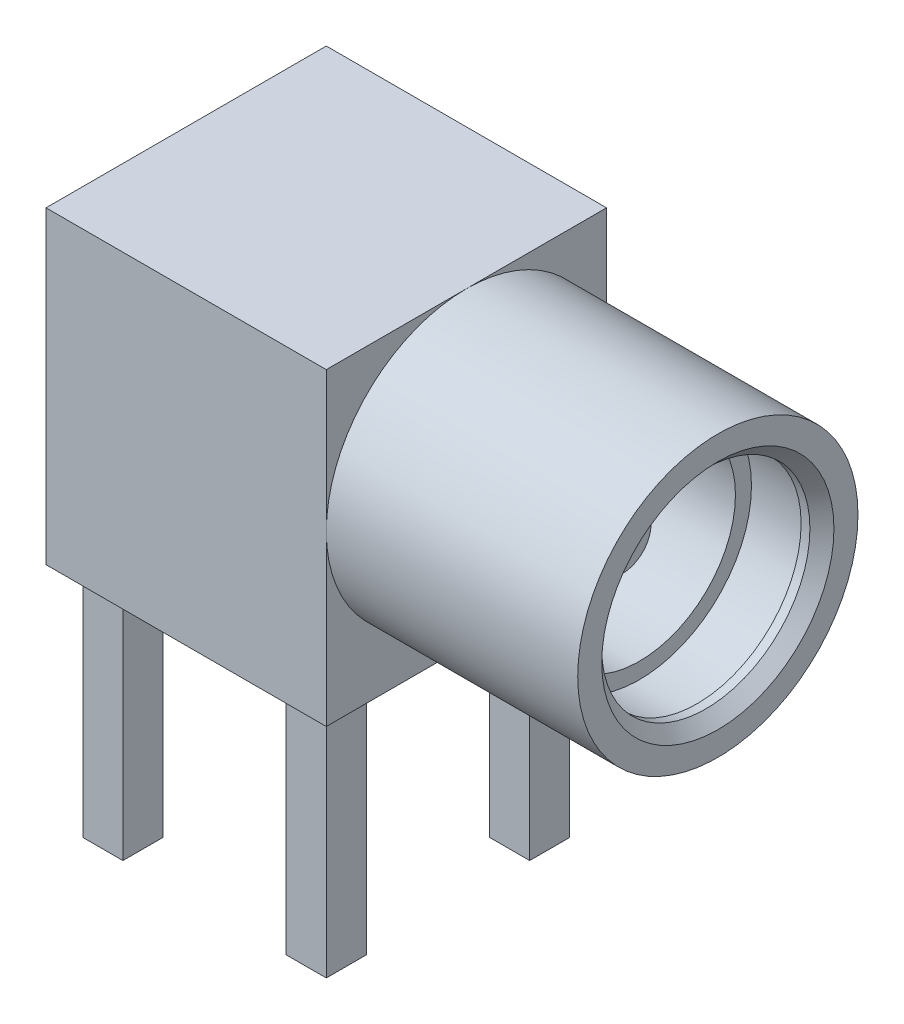
ISO-10303-21;
HEADER;
FILE_DESCRIPTION(('STEP AP214'),'2;1');
FILE_NAME('part.step','',(''),(''),'','','');
FILE_SCHEMA(('AUTOMOTIVE_DESIGN { 1 0 10303 214 1 1 1 1 }'));
ENDSEC;
DATA;
#1=APPLICATION_CONTEXT('core data for automotive mechanical design processes');
#2=APPLICATION_PROTOCOL_DEFINITION('international standard','automotive_design',2000,#1);
#3=PRODUCT_CONTEXT('',#1,'mechanical');
#4=PRODUCT('Part','Part','',(#3));
#5=PRODUCT_RELATED_PRODUCT_CATEGORY('part','',(#4));
#6=PRODUCT_DEFINITION_FORMATION('','',#4);
#7=PRODUCT_DEFINITION_CONTEXT('part definition',#1,'design');
#8=PRODUCT_DEFINITION('design','',#6,#7);
#9=PRODUCT_DEFINITION_SHAPE('','',#8);
#10=(LENGTH_UNIT() NAMED_UNIT(*) SI_UNIT(.MILLI.,.METRE.));
#11=(NAMED_UNIT(*) PLANE_ANGLE_UNIT() SI_UNIT($,.RADIAN.));
#12=(NAMED_UNIT(*) SI_UNIT($,.STERADIAN.) SOLID_ANGLE_UNIT());
#13=UNCERTAINTY_MEASURE_WITH_UNIT(LENGTH_MEASURE(1.E-05),#10,'distance_accuracy_value','');
#14=(GEOMETRIC_REPRESENTATION_CONTEXT(3) GLOBAL_UNCERTAINTY_ASSIGNED_CONTEXT((#13)) GLOBAL_UNIT_ASSIGNED_CONTEXT((#10,
#11,#12)) REPRESENTATION_CONTEXT('',''));
#15=CARTESIAN_POINT('',(0.,0.,0.));
#16=DIRECTION('',(0.,0.,1.));
#17=DIRECTION('',(1.,0.,0.));
#18=AXIS2_PLACEMENT_3D('',#15,#16,#17);
#19=CARTESIAN_POINT('',(43.4625000000001,-43.6500000000006,22.54));
#20=DIRECTION('',(1.,0.,0.));
#21=DIRECTION('',(0.,0.,-1.));
#22=AXIS2_PLACEMENT_3D('',#19,#20,#21);
#23=PLANE('',#22);
#24=CARTESIAN_POINT('',(43.4625000000001,-43.6500000000006,22.54));
#25=DIRECTION('',(1.,0.,0.));
#26=DIRECTION('',(0.,0.,-1.));
#27=AXIS2_PLACEMENT_3D('',#24,#25,#26);
#28=CIRCLE('',#27,0.355);
#29=CARTESIAN_POINT('',(43.4625000000001,-43.6500000000006,22.185));
#30=VERTEX_POINT('',#29);
#31=EDGE_CURVE('E20',#30,#30,#28,.F.);
#32=ORIENTED_EDGE('',*,*,#31,.F.);
#33=EDGE_LOOP('',(#32));
#34=FACE_BOUND('',#33,.T.);
#35=ADVANCED_FACE('F17',(#34),#23,.T.);
#36=CARTESIAN_POINT('',(42.0625000000001,-43.6500000000006,22.54));
#37=DIRECTION('',(1.,0.,0.));
#38=DIRECTION('',(0.,0.,-1.));
#39=AXIS2_PLACEMENT_3D('',#36,#37,#38);
#40=CYLINDRICAL_SURFACE('',#39,0.355);
#41=CARTESIAN_POINT('',(42.0625000000001,-43.6500000000006,22.54));
#42=DIRECTION('',(1.,0.,0.));
#43=DIRECTION('',(0.,0.,-1.));
#44=AXIS2_PLACEMENT_3D('',#41,#42,#43);
#45=CIRCLE('',#44,0.355);
#46=CARTESIAN_POINT('',(42.0625000000001,-43.6500000000006,22.185));
#47=VERTEX_POINT('',#46);
#48=EDGE_CURVE('E375',#47,#47,#45,.F.);
#49=ORIENTED_EDGE('',*,*,#48,.F.);
#50=EDGE_LOOP('',(#49));
#51=FACE_BOUND('',#50,.T.);
#52=ORIENTED_EDGE('',*,*,#31,.T.);
#53=EDGE_LOOP('',(#52));
#54=FACE_BOUND('',#53,.T.);
#55=ADVANCED_FACE('F382',(#51,#54),#40,.T.);
#56=CARTESIAN_POINT('',(42.0625000000001,-43.6500000000006,22.54));
#57=DIRECTION('',(1.,0.,0.));
#58=DIRECTION('',(0.,0.,-1.));
#59=AXIS2_PLACEMENT_3D('',#56,#57,#58);
#60=PLANE('',#59);
#61=ORIENTED_EDGE('',*,*,#48,.T.);
#62=EDGE_LOOP('',(#61));
#63=FACE_BOUND('',#62,.T.);
#64=CARTESIAN_POINT('',(42.0625000000001,-43.6500000000006,22.54));
#65=DIRECTION('',(1.,0.,0.));
#66=DIRECTION('',(0.,0.,-1.));
#67=AXIS2_PLACEMENT_3D('',#64,#65,#66);
#68=CIRCLE('',#67,1.2);
#69=CARTESIAN_POINT('',(42.0625000000001,-43.6500000000006,21.34));
#70=VERTEX_POINT('',#69);
#71=EDGE_CURVE('E373',#70,#70,#68,.T.);
#72=ORIENTED_EDGE('',*,*,#71,.T.);
#73=EDGE_LOOP('',(#72));
#74=FACE_BOUND('',#73,.T.);
#75=ADVANCED_FACE('F389',(#63,#74),#60,.T.);
#76=CARTESIAN_POINT('',(44.6525000000001,-43.6500000000006,22.54));
#77=DIRECTION('',(1.,0.,0.));
#78=DIRECTION('',(0.,0.,-1.));
#79=AXIS2_PLACEMENT_3D('',#76,#77,#78);
#80=CYLINDRICAL_SURFACE('',#79,1.2);
#81=CARTESIAN_POINT('',(43.6725000000001,-43.6500000000006,22.54));
#82=DIRECTION('',(1.,0.,0.));
#83=DIRECTION('',(0.,0.,-1.));
#84=AXIS2_PLACEMENT_3D('',#81,#82,#83);
#85=CIRCLE('',#84,1.2);
#86=CARTESIAN_POINT('',(43.6725000000001,-43.6500000000006,21.34));
#87=VERTEX_POINT('',#86);
#88=EDGE_CURVE('E370',#87,#87,#85,.F.);
#89=ORIENTED_EDGE('',*,*,#88,.F.);
#90=EDGE_LOOP('',(#89));
#91=FACE_BOUND('',#90,.T.);
#92=ORIENTED_EDGE('',*,*,#71,.F.);
#93=EDGE_LOOP('',(#92));
#94=FACE_BOUND('',#93,.T.);
#95=ADVANCED_FACE('F540',(#91,#94),#80,.F.);
#96=CARTESIAN_POINT('',(43.6725000000001,-43.6500000000006,23.3175));
#97=DIRECTION('',(1.,0.,0.));
#98=DIRECTION('',(0.,0.,-1.));
#99=AXIS2_PLACEMENT_3D('',#96,#97,#98);
#100=PLANE('',#99);
#101=ORIENTED_EDGE('',*,*,#88,.T.);
#102=EDGE_LOOP('',(#101));
#103=FACE_BOUND('',#102,.T.);
#104=CARTESIAN_POINT('',(43.6725000000001,-43.6500000000006,22.54));
#105=DIRECTION('',(1.,0.,0.));
#106=DIRECTION('',(0.,0.,-1.));
#107=AXIS2_PLACEMENT_3D('',#104,#105,#106);
#108=CIRCLE('',#107,1.4);
#109=CARTESIAN_POINT('',(43.6725000000001,-43.6500000000006,21.14));
#110=VERTEX_POINT('',#109);
#111=EDGE_CURVE('E344',#110,#110,#108,.T.);
#112=ORIENTED_EDGE('',*,*,#111,.T.);
#113=EDGE_LOOP('',(#112));
#114=FACE_BOUND('',#113,.T.);
#115=ADVANCED_FACE('F536',(#103,#114),#100,.T.);
#116=CARTESIAN_POINT('',(43.6725000000001,-43.6500000000006,22.54));
#117=DIRECTION('',(1.,0.,0.));
#118=DIRECTION('',(0.,0.,-1.));
#119=AXIS2_PLACEMENT_3D('',#116,#117,#118);
#120=CYLINDRICAL_SURFACE('',#119,1.4);
#121=CARTESIAN_POINT('',(44.3925000000001,-43.6500000000006,22.54));
#122=DIRECTION('',(1.,0.,0.));
#123=DIRECTION('',(0.,0.,-1.));
#124=AXIS2_PLACEMENT_3D('',#121,#122,#123);
#125=CIRCLE('',#124,1.4);
#126=CARTESIAN_POINT('',(44.3925000000001,-43.6500000000006,21.14));
#127=VERTEX_POINT('',#126);
#128=EDGE_CURVE('E335',#127,#127,#125,.T.);
#129=ORIENTED_EDGE('',*,*,#128,.T.);
#130=EDGE_LOOP('',(#129));
#131=FACE_BOUND('',#130,.T.);
#132=ORIENTED_EDGE('',*,*,#111,.F.);
#133=EDGE_LOOP('',(#132));
#134=FACE_BOUND('',#133,.T.);
#135=ADVANCED_FACE('F532',(#131,#134),#120,.F.);
#136=CARTESIAN_POINT('',(39.7625000000001,-48.7100000000005,22.54));
#137=DIRECTION('',(0.,-1.,0.));
#138=DIRECTION('',(1.,0.,0.));
#139=AXIS2_PLACEMENT_3D('',#136,#137,#138);
#140=PLANE('',#139);
#141=CARTESIAN_POINT('',(39.7625000000001,-48.7099999999714,22.54));
#142=DIRECTION('',(0.,1.,0.));
#143=DIRECTION('',(-1.,0.,0.));
#144=AXIS2_PLACEMENT_3D('',#141,#142,#143);
#145=CIRCLE('',#144,0.205000000043091);
#146=CARTESIAN_POINT('',(39.557499999957,-48.7099999999714,22.54));
#147=VERTEX_POINT('',#146);
#148=EDGE_CURVE('E330',#147,#147,#145,.T.);
#149=ORIENTED_EDGE('',*,*,#148,.F.);
#150=EDGE_LOOP('',(#149));
#151=FACE_BOUND('',#150,.T.);
#152=ADVANCED_FACE('F528',(#151),#140,.T.);
#153=CARTESIAN_POINT('',(38.2425000000001,-45.4000000000005,24.06));
#154=DIRECTION('',(0.,0.,1.));
#155=DIRECTION('',(1.,0.,0.));
#156=AXIS2_PLACEMENT_3D('',#153,#154,#155);
#157=PLANE('',#156);
#158=DIRECTION('',(1.,0.,0.));
#159=VECTOR('',#158,1.);
#160=CARTESIAN_POINT('',(39.7625000000001,-48.7100000000005,24.06));
#161=LINE('',#160,#159);
#162=CARTESIAN_POINT('',(38.7425000000001,-48.7100000000005,24.06));
#163=VERTEX_POINT('',#162);
#164=CARTESIAN_POINT('',(38.2425000000001,-48.7100000000005,24.06));
#165=VERTEX_POINT('',#164);
#166=EDGE_CURVE('E320',#163,#165,#161,.F.);
#167=ORIENTED_EDGE('',*,*,#166,.F.);
#168=DIRECTION('',(0.,1.,0.));
#169=VECTOR('',#168,1.);
#170=CARTESIAN_POINT('',(38.7425000000001,-45.4000000000005,24.06));
#171=LINE('',#170,#169);
#172=CARTESIAN_POINT('',(38.7425000000001,-45.7600000000006,24.06));
#173=VERTEX_POINT('',#172);
#174=EDGE_CURVE('E325',#173,#163,#171,.F.);
#175=ORIENTED_EDGE('',*,*,#174,.F.);
#176=DIRECTION('',(1.,0.,0.));
#177=VECTOR('',#176,1.);
#178=CARTESIAN_POINT('',(38.2425000000001,-45.7600000000006,24.06));
#179=LINE('',#178,#177);
#180=CARTESIAN_POINT('',(38.2425000000001,-45.7600000000005,24.06));
#181=VERTEX_POINT('',#180);
#182=EDGE_CURVE('E342',#173,#181,#179,.F.);
#183=ORIENTED_EDGE('',*,*,#182,.T.);
#184=DIRECTION('',(0.,1.,0.));
#185=VECTOR('',#184,1.);
#186=CARTESIAN_POINT('',(38.2425000000001,-45.4000000000005,24.06));
#187=LINE('',#186,#185);
#188=EDGE_CURVE('E312',#165,#181,#187,.T.);
#189=ORIENTED_EDGE('',*,*,#188,.F.);
#190=EDGE_LOOP('',(#167,#175,#183,#189));
#191=FACE_BOUND('',#190,.T.);
#192=ADVANCED_FACE('F524',(#191),#157,.T.);
#193=CARTESIAN_POINT('',(40.7825000000001,-45.4000000000005,21.52));
#194=DIRECTION('',(0.,0.,1.));
#195=DIRECTION('',(1.,0.,0.));
#196=AXIS2_PLACEMENT_3D('',#193,#194,#195);
#197=PLANE('',#196);
#198=DIRECTION('',(1.,0.,0.));
#199=VECTOR('',#198,1.);
#200=CARTESIAN_POINT('',(39.7625000000001,-48.7100000000005,21.52));
#201=LINE('',#200,#199);
#202=CARTESIAN_POINT('',(41.2825000000001,-48.7100000000005,21.52));
#203=VERTEX_POINT('',#202);
#204=CARTESIAN_POINT('',(40.7825000000001,-48.7100000000005,21.52));
#205=VERTEX_POINT('',#204);
#206=EDGE_CURVE('E302',#203,#205,#201,.F.);
#207=ORIENTED_EDGE('',*,*,#206,.F.);
#208=DIRECTION('',(0.,1.,0.));
#209=VECTOR('',#208,1.);
#210=CARTESIAN_POINT('',(41.2825000000001,-45.4000000000006,21.52));
#211=LINE('',#210,#209);
#212=CARTESIAN_POINT('',(41.2825000000001,-45.7600000000006,21.52));
#213=VERTEX_POINT('',#212);
#214=EDGE_CURVE('E307',#213,#203,#211,.F.);
#215=ORIENTED_EDGE('',*,*,#214,.F.);
#216=DIRECTION('',(1.,0.,0.));
#217=VECTOR('',#216,1.);
#218=CARTESIAN_POINT('',(40.7825000000001,-45.7600000000006,21.52));
#219=LINE('',#218,#217);
#220=CARTESIAN_POINT('',(40.7825000000001,-45.7600000000006,21.52));
#221=VERTEX_POINT('',#220);
#222=EDGE_CURVE('E339',#213,#221,#219,.F.);
#223=ORIENTED_EDGE('',*,*,#222,.T.);
#224=DIRECTION('',(0.,1.,0.));
#225=VECTOR('',#224,1.);
#226=CARTESIAN_POINT('',(40.7825000000001,-45.4000000000005,21.52));
#227=LINE('',#226,#225);
#228=EDGE_CURVE('E294',#205,#221,#227,.T.);
#229=ORIENTED_EDGE('',*,*,#228,.F.);
#230=EDGE_LOOP('',(#207,#215,#223,#229));
#231=FACE_BOUND('',#230,.T.);
#232=ADVANCED_FACE('F520',(#231),#197,.T.);
#233=CARTESIAN_POINT('',(38.7425000000001,-45.4000000000005,21.02));
#234=DIRECTION('',(0.,0.,-1.));
#235=DIRECTION('',(-1.,0.,0.));
#236=AXIS2_PLACEMENT_3D('',#233,#234,#235);
#237=PLANE('',#236);
#238=DIRECTION('',(1.,0.,0.));
#239=VECTOR('',#238,1.);
#240=CARTESIAN_POINT('',(39.7625000000001,-48.7100000000005,21.02));
#241=LINE('',#240,#239);
#242=CARTESIAN_POINT('',(38.2425000000001,-48.7100000000005,21.02));
#243=VERTEX_POINT('',#242);
#244=CARTESIAN_POINT('',(38.7425000000001,-48.7100000000005,21.02));
#245=VERTEX_POINT('',#244);
#246=EDGE_CURVE('E286',#243,#245,#241,.T.);
#247=ORIENTED_EDGE('',*,*,#246,.F.);
#248=DIRECTION('',(0.,1.,0.));
#249=VECTOR('',#248,1.);
#250=CARTESIAN_POINT('',(38.2425000000001,-45.4000000000005,21.02));
#251=LINE('',#250,#249);
#252=CARTESIAN_POINT('',(38.2425000000001,-45.7600000000005,21.02));
#253=VERTEX_POINT('',#252);
#254=EDGE_CURVE('E288',#253,#243,#251,.F.);
#255=ORIENTED_EDGE('',*,*,#254,.F.);
#256=DIRECTION('',(-1.,0.,0.));
#257=VECTOR('',#256,1.);
#258=CARTESIAN_POINT('',(38.7425000000001,-45.7600000000005,21.02));
#259=LINE('',#258,#257);
#260=CARTESIAN_POINT('',(38.7425000000001,-45.7600000000005,21.02));
#261=VERTEX_POINT('',#260);
#262=EDGE_CURVE('E336',#253,#261,#259,.F.);
#263=ORIENTED_EDGE('',*,*,#262,.T.);
#264=DIRECTION('',(0.,1.,0.));
#265=VECTOR('',#264,1.);
#266=CARTESIAN_POINT('',(38.7425000000001,-45.4000000000005,21.02));
#267=LINE('',#266,#265);
#268=EDGE_CURVE('E275',#245,#261,#267,.T.);
#269=ORIENTED_EDGE('',*,*,#268,.F.);
#270=EDGE_LOOP('',(#247,#255,#263,#269));
#271=FACE_BOUND('',#270,.T.);
#272=ADVANCED_FACE('F516',(#271),#237,.T.);
#273=CARTESIAN_POINT('',(40.7825000000001,-45.4000000000005,24.06));
#274=DIRECTION('',(0.,0.,1.));
#275=DIRECTION('',(1.,0.,0.));
#276=AXIS2_PLACEMENT_3D('',#273,#274,#275);
#277=PLANE('',#276);
#278=DIRECTION('',(1.,0.,0.));
#279=VECTOR('',#278,1.);
#280=CARTESIAN_POINT('',(39.7625000000001,-48.7100000000005,24.06));
#281=LINE('',#280,#279);
#282=CARTESIAN_POINT('',(41.2825000000001,-48.7100000000005,24.06));
#283=VERTEX_POINT('',#282);
#284=CARTESIAN_POINT('',(40.7825000000001,-48.7100000000005,24.06));
#285=VERTEX_POINT('',#284);
#286=EDGE_CURVE('E172',#283,#285,#281,.F.);
#287=ORIENTED_EDGE('',*,*,#286,.F.);
#288=DIRECTION('',(0.,1.,0.));
#289=VECTOR('',#288,1.);
#290=CARTESIAN_POINT('',(41.2825000000001,-45.4000000000006,24.06));
#291=LINE('',#290,#289);
#292=CARTESIAN_POINT('',(41.2825000000001,-45.7600000000006,24.06));
#293=VERTEX_POINT('',#292);
#294=EDGE_CURVE('E272',#293,#283,#291,.F.);
#295=ORIENTED_EDGE('',*,*,#294,.F.);
#296=DIRECTION('',(1.,0.,0.));
#297=VECTOR('',#296,1.);
#298=CARTESIAN_POINT('',(40.7825000000001,-45.7600000000006,24.06));
#299=LINE('',#298,#297);
#300=CARTESIAN_POINT('',(40.7825000000001,-45.7600000000006,24.06));
#301=VERTEX_POINT('',#300);
#302=EDGE_CURVE('E333',#293,#301,#299,.F.);
#303=ORIENTED_EDGE('',*,*,#302,.T.);
#304=DIRECTION('',(0.,1.,0.));
#305=VECTOR('',#304,1.);
#306=CARTESIAN_POINT('',(40.7825000000001,-45.4000000000005,24.06));
#307=LINE('',#306,#305);
#308=EDGE_CURVE('E167',#285,#301,#307,.T.);
#309=ORIENTED_EDGE('',*,*,#308,.F.);
#310=EDGE_LOOP('',(#287,#295,#303,#309));
#311=FACE_BOUND('',#310,.T.);
#312=ADVANCED_FACE('F512',(#311),#277,.T.);
#313=CARTESIAN_POINT('',(44.3925000000001,-43.6500000000006,23.3175));
#314=DIRECTION('',(1.,0.,0.));
#315=DIRECTION('',(0.,0.,-1.));
#316=AXIS2_PLACEMENT_3D('',#313,#314,#315);
#317=PLANE('',#316);
#318=ORIENTED_EDGE('',*,*,#128,.F.);
#319=EDGE_LOOP('',(#318));
#320=FACE_BOUND('',#319,.T.);
#321=CARTESIAN_POINT('',(44.3925000000001,-43.6500000000006,22.54));
#322=DIRECTION('',(1.,0.,0.));
#323=DIRECTION('',(0.,0.,-1.));
#324=AXIS2_PLACEMENT_3D('',#321,#322,#323);
#325=CIRCLE('',#324,1.3);
#326=CARTESIAN_POINT('',(44.3925000000001,-43.6500000000006,21.24));
#327=VERTEX_POINT('',#326);
#328=EDGE_CURVE('E266',#327,#327,#325,.T.);
#329=ORIENTED_EDGE('',*,*,#328,.T.);
#330=EDGE_LOOP('',(#329));
#331=FACE_BOUND('',#330,.T.);
#332=ADVANCED_FACE('F508',(#320,#331),#317,.F.);
#333=CARTESIAN_POINT('',(39.7625000000001,-48.5600000001227,22.54));
#334=DIRECTION('',(0.,1.,0.));
#335=DIRECTION('',(-1.,0.,0.));
#336=AXIS2_PLACEMENT_3D('',#333,#334,#335);
#337=CONICAL_SURFACE('',#336,0.354999999948594,0.785398163586926);
#338=CARTESIAN_POINT('',(39.7625000000001,-48.5600000000005,22.54));
#339=DIRECTION('',(0.,-1.,0.));
#340=DIRECTION('',(1.,0.,0.));
#341=AXIS2_PLACEMENT_3D('',#338,#339,#340);
#342=CIRCLE('',#341,0.355);
#343=CARTESIAN_POINT('',(40.1175000000001,-48.5600000000005,22.54));
#344=VERTEX_POINT('',#343);
#345=EDGE_CURVE('E262',#344,#344,#342,.F.);
#346=ORIENTED_EDGE('',*,*,#345,.F.);
#347=EDGE_LOOP('',(#346));
#348=FACE_BOUND('',#347,.T.);
#349=ORIENTED_EDGE('',*,*,#148,.T.);
#350=EDGE_LOOP('',(#349));
#351=FACE_BOUND('',#350,.T.);
#352=ADVANCED_FACE('F504',(#348,#351),#337,.T.);
#353=CARTESIAN_POINT('',(38.7425000000001,-45.4000000000005,24.06));
#354=DIRECTION('',(1.,0.,0.));
#355=DIRECTION('',(0.,0.,-1.));
#356=AXIS2_PLACEMENT_3D('',#353,#354,#355);
#357=PLANE('',#356);
#358=DIRECTION('',(0.,0.,1.));
#359=VECTOR('',#358,1.);
#360=CARTESIAN_POINT('',(38.7425000000001,-48.7100000000005,22.54));
#361=LINE('',#360,#359);
#362=CARTESIAN_POINT('',(38.7425000000001,-48.7100000000005,23.56));
#363=VERTEX_POINT('',#362);
#364=EDGE_CURVE('E322',#363,#163,#361,.T.);
#365=ORIENTED_EDGE('',*,*,#364,.F.);
#366=DIRECTION('',(0.,1.,0.));
#367=VECTOR('',#366,1.);
#368=CARTESIAN_POINT('',(38.7425000000001,-45.4000000000005,23.56));
#369=LINE('',#368,#367);
#370=CARTESIAN_POINT('',(38.7425000000001,-45.7600000000006,23.56));
#371=VERTEX_POINT('',#370);
#372=EDGE_CURVE('E259',#371,#363,#369,.F.);
#373=ORIENTED_EDGE('',*,*,#372,.F.);
#374=DIRECTION('',(0.,0.,-1.));
#375=VECTOR('',#374,1.);
#376=CARTESIAN_POINT('',(38.7425000000001,-45.7600000000006,24.06));
#377=LINE('',#376,#375);
#378=EDGE_CURVE('E327',#371,#173,#377,.F.);
#379=ORIENTED_EDGE('',*,*,#378,.T.);
#380=ORIENTED_EDGE('',*,*,#174,.T.);
#381=EDGE_LOOP('',(#365,#373,#379,#380));
#382=FACE_BOUND('',#381,.T.);
#383=ADVANCED_FACE('F500',(#382),#357,.T.);
#384=CARTESIAN_POINT('',(39.7625000000001,-48.7100000000005,22.54));
#385=DIRECTION('',(0.,-1.,0.));
#386=DIRECTION('',(1.,0.,0.));
#387=AXIS2_PLACEMENT_3D('',#384,#385,#386);
#388=PLANE('',#387);
#389=ORIENTED_EDGE('',*,*,#166,.T.);
#390=DIRECTION('',(0.,0.,1.));
#391=VECTOR('',#390,1.);
#392=CARTESIAN_POINT('',(38.2425000000001,-48.7100000000005,23.56));
#393=LINE('',#392,#391);
#394=CARTESIAN_POINT('',(38.2425000000001,-48.7100000000005,23.56));
#395=VERTEX_POINT('',#394);
#396=EDGE_CURVE('E315',#395,#165,#393,.T.);
#397=ORIENTED_EDGE('',*,*,#396,.F.);
#398=DIRECTION('',(-1.,0.,0.));
#399=VECTOR('',#398,1.);
#400=CARTESIAN_POINT('',(38.7425000000001,-48.7100000000005,23.56));
#401=LINE('',#400,#399);
#402=EDGE_CURVE('E256',#363,#395,#401,.T.);
#403=ORIENTED_EDGE('',*,*,#402,.F.);
#404=ORIENTED_EDGE('',*,*,#364,.T.);
#405=EDGE_LOOP('',(#389,#397,#403,#404));
#406=FACE_BOUND('',#405,.T.);
#407=ADVANCED_FACE('F496',(#406),#388,.T.);
#408=CARTESIAN_POINT('',(38.2425000000001,-45.4000000000005,23.56));
#409=DIRECTION('',(-1.,0.,0.));
#410=DIRECTION('',(0.,0.,1.));
#411=AXIS2_PLACEMENT_3D('',#408,#409,#410);
#412=PLANE('',#411);
#413=ORIENTED_EDGE('',*,*,#396,.T.);
#414=ORIENTED_EDGE('',*,*,#188,.T.);
#415=DIRECTION('',(0.,0.,1.));
#416=VECTOR('',#415,1.);
#417=CARTESIAN_POINT('',(38.2425000000001,-45.7600000000005,23.56));
#418=LINE('',#417,#416);
#419=CARTESIAN_POINT('',(38.2425000000001,-45.7600000000005,23.56));
#420=VERTEX_POINT('',#419);
#421=EDGE_CURVE('E318',#181,#420,#418,.F.);
#422=ORIENTED_EDGE('',*,*,#421,.T.);
#423=DIRECTION('',(0.,1.,0.));
#424=VECTOR('',#423,1.);
#425=CARTESIAN_POINT('',(38.2425000000001,-45.4000000000005,23.56));
#426=LINE('',#425,#424);
#427=EDGE_CURVE('E253',#395,#420,#426,.T.);
#428=ORIENTED_EDGE('',*,*,#427,.F.);
#429=EDGE_LOOP('',(#413,#414,#422,#428));
#430=FACE_BOUND('',#429,.T.);
#431=ADVANCED_FACE('F492',(#430),#412,.T.);
#432=CARTESIAN_POINT('',(41.2825000000001,-45.4000000000006,21.52));
#433=DIRECTION('',(1.,0.,0.));
#434=DIRECTION('',(0.,0.,-1.));
#435=AXIS2_PLACEMENT_3D('',#432,#433,#434);
#436=PLANE('',#435);
#437=DIRECTION('',(0.,0.,1.));
#438=VECTOR('',#437,1.);
#439=CARTESIAN_POINT('',(41.2825000000001,-48.7100000000005,22.54));
#440=LINE('',#439,#438);
#441=CARTESIAN_POINT('',(41.2825000000001,-48.7100000000005,21.02));
#442=VERTEX_POINT('',#441);
#443=EDGE_CURVE('E304',#442,#203,#440,.T.);
#444=ORIENTED_EDGE('',*,*,#443,.F.);
#445=DIRECTION('',(0.,1.,0.));
#446=VECTOR('',#445,1.);
#447=CARTESIAN_POINT('',(41.2825000000001,-45.4000000000006,21.02));
#448=LINE('',#447,#446);
#449=CARTESIAN_POINT('',(41.2825000000001,-45.7600000000006,21.02));
#450=VERTEX_POINT('',#449);
#451=EDGE_CURVE('E250',#450,#442,#448,.F.);
#452=ORIENTED_EDGE('',*,*,#451,.F.);
#453=DIRECTION('',(0.,0.,-1.));
#454=VECTOR('',#453,1.);
#455=CARTESIAN_POINT('',(41.2825000000001,-45.7600000000006,21.52));
#456=LINE('',#455,#454);
#457=EDGE_CURVE('E309',#450,#213,#456,.F.);
#458=ORIENTED_EDGE('',*,*,#457,.T.);
#459=ORIENTED_EDGE('',*,*,#214,.T.);
#460=EDGE_LOOP('',(#444,#452,#458,#459));
#461=FACE_BOUND('',#460,.T.);
#462=ADVANCED_FACE('F488',(#461),#436,.T.);
#463=CARTESIAN_POINT('',(39.7625000000001,-48.7100000000005,22.54));
#464=DIRECTION('',(0.,-1.,0.));
#465=DIRECTION('',(1.,0.,0.));
#466=AXIS2_PLACEMENT_3D('',#463,#464,#465);
#467=PLANE('',#466);
#468=ORIENTED_EDGE('',*,*,#206,.T.);
#469=DIRECTION('',(0.,0.,1.));
#470=VECTOR('',#469,1.);
#471=CARTESIAN_POINT('',(40.7825000000001,-48.7100000000005,21.02));
#472=LINE('',#471,#470);
#473=CARTESIAN_POINT('',(40.7825000000001,-48.7100000000005,21.02));
#474=VERTEX_POINT('',#473);
#475=EDGE_CURVE('E297',#474,#205,#472,.T.);
#476=ORIENTED_EDGE('',*,*,#475,.F.);
#477=DIRECTION('',(-1.,0.,0.));
#478=VECTOR('',#477,1.);
#479=CARTESIAN_POINT('',(41.2825000000001,-48.7100000000005,21.02));
#480=LINE('',#479,#478);
#481=EDGE_CURVE('E247',#442,#474,#480,.T.);
#482=ORIENTED_EDGE('',*,*,#481,.F.);
#483=ORIENTED_EDGE('',*,*,#443,.T.);
#484=EDGE_LOOP('',(#468,#476,#482,#483));
#485=FACE_BOUND('',#484,.T.);
#486=ADVANCED_FACE('F484',(#485),#467,.T.);
#487=CARTESIAN_POINT('',(40.7825000000001,-45.4000000000005,21.02));
#488=DIRECTION('',(-1.,0.,0.));
#489=DIRECTION('',(0.,0.,1.));
#490=AXIS2_PLACEMENT_3D('',#487,#488,#489);
#491=PLANE('',#490);
#492=ORIENTED_EDGE('',*,*,#475,.T.);
#493=ORIENTED_EDGE('',*,*,#228,.T.);
#494=DIRECTION('',(0.,0.,1.));
#495=VECTOR('',#494,1.);
#496=CARTESIAN_POINT('',(40.7825000000001,-45.7600000000006,21.02));
#497=LINE('',#496,#495);
#498=CARTESIAN_POINT('',(40.7825000000001,-45.7600000000006,21.02));
#499=VERTEX_POINT('',#498);
#500=EDGE_CURVE('E300',#221,#499,#497,.F.);
#501=ORIENTED_EDGE('',*,*,#500,.T.);
#502=DIRECTION('',(0.,1.,0.));
#503=VECTOR('',#502,1.);
#504=CARTESIAN_POINT('',(40.7825000000001,-45.4000000000006,21.02));
#505=LINE('',#504,#503);
#506=EDGE_CURVE('E244',#474,#499,#505,.T.);
#507=ORIENTED_EDGE('',*,*,#506,.F.);
#508=EDGE_LOOP('',(#492,#493,#501,#507));
#509=FACE_BOUND('',#508,.T.);
#510=ADVANCED_FACE('F480',(#509),#491,.T.);
#511=CARTESIAN_POINT('',(38.2425000000001,-45.4000000000005,21.02));
#512=DIRECTION('',(-1.,0.,0.));
#513=DIRECTION('',(0.,0.,1.));
#514=AXIS2_PLACEMENT_3D('',#511,#512,#513);
#515=PLANE('',#514);
#516=DIRECTION('',(0.,0.,1.));
#517=VECTOR('',#516,1.);
#518=CARTESIAN_POINT('',(38.2425000000001,-48.7100000000005,22.54));
#519=LINE('',#518,#517);
#520=CARTESIAN_POINT('',(38.2425000000001,-48.7100000000005,21.52));
#521=VERTEX_POINT('',#520);
#522=EDGE_CURVE('E283',#521,#243,#519,.F.);
#523=ORIENTED_EDGE('',*,*,#522,.F.);
#524=DIRECTION('',(0.,1.,0.));
#525=VECTOR('',#524,1.);
#526=CARTESIAN_POINT('',(38.2425000000001,-45.4000000000005,21.52));
#527=LINE('',#526,#525);
#528=CARTESIAN_POINT('',(38.2425000000001,-45.7600000000005,21.52));
#529=VERTEX_POINT('',#528);
#530=EDGE_CURVE('E241',#529,#521,#527,.F.);
#531=ORIENTED_EDGE('',*,*,#530,.F.);
#532=DIRECTION('',(0.,0.,1.));
#533=VECTOR('',#532,1.);
#534=CARTESIAN_POINT('',(38.2425000000001,-45.7600000000005,21.02));
#535=LINE('',#534,#533);
#536=EDGE_CURVE('E291',#529,#253,#535,.F.);
#537=ORIENTED_EDGE('',*,*,#536,.T.);
#538=ORIENTED_EDGE('',*,*,#254,.T.);
#539=EDGE_LOOP('',(#523,#531,#537,#538));
#540=FACE_BOUND('',#539,.T.);
#541=ADVANCED_FACE('F476',(#540),#515,.T.);
#542=CARTESIAN_POINT('',(39.7625000000001,-48.7100000000005,22.54));
#543=DIRECTION('',(0.,-1.,0.));
#544=DIRECTION('',(1.,0.,0.));
#545=AXIS2_PLACEMENT_3D('',#542,#543,#544);
#546=PLANE('',#545);
#547=DIRECTION('',(1.,0.,0.));
#548=VECTOR('',#547,1.);
#549=CARTESIAN_POINT('',(38.2425000000001,-48.7100000000005,21.52));
#550=LINE('',#549,#548);
#551=CARTESIAN_POINT('',(38.7425000000001,-48.7100000000005,21.52));
#552=VERTEX_POINT('',#551);
#553=EDGE_CURVE('E238',#521,#552,#550,.T.);
#554=ORIENTED_EDGE('',*,*,#553,.F.);
#555=ORIENTED_EDGE('',*,*,#522,.T.);
#556=ORIENTED_EDGE('',*,*,#246,.T.);
#557=DIRECTION('',(0.,0.,-1.));
#558=VECTOR('',#557,1.);
#559=CARTESIAN_POINT('',(38.7425000000001,-48.7100000000005,21.52));
#560=LINE('',#559,#558);
#561=EDGE_CURVE('E278',#552,#245,#560,.T.);
#562=ORIENTED_EDGE('',*,*,#561,.F.);
#563=EDGE_LOOP('',(#554,#555,#556,#562));
#564=FACE_BOUND('',#563,.T.);
#565=ADVANCED_FACE('F472',(#564),#546,.T.);
#566=CARTESIAN_POINT('',(38.7425000000001,-45.4000000000005,21.52));
#567=DIRECTION('',(1.,0.,0.));
#568=DIRECTION('',(0.,0.,-1.));
#569=AXIS2_PLACEMENT_3D('',#566,#567,#568);
#570=PLANE('',#569);
#571=ORIENTED_EDGE('',*,*,#561,.T.);
#572=ORIENTED_EDGE('',*,*,#268,.T.);
#573=DIRECTION('',(0.,0.,-1.));
#574=VECTOR('',#573,1.);
#575=CARTESIAN_POINT('',(38.7425000000001,-45.7600000000006,21.52));
#576=LINE('',#575,#574);
#577=CARTESIAN_POINT('',(38.7425000000001,-45.7600000000006,21.52));
#578=VERTEX_POINT('',#577);
#579=EDGE_CURVE('E281',#261,#578,#576,.F.);
#580=ORIENTED_EDGE('',*,*,#579,.T.);
#581=DIRECTION('',(0.,1.,0.));
#582=VECTOR('',#581,1.);
#583=CARTESIAN_POINT('',(38.7425000000001,-45.4000000000005,21.52));
#584=LINE('',#583,#582);
#585=EDGE_CURVE('E235',#552,#578,#584,.T.);
#586=ORIENTED_EDGE('',*,*,#585,.F.);
#587=EDGE_LOOP('',(#571,#572,#580,#586));
#588=FACE_BOUND('',#587,.T.);
#589=ADVANCED_FACE('F468',(#588),#570,.T.);
#590=CARTESIAN_POINT('',(41.2825000000001,-45.4000000000006,24.06));
#591=DIRECTION('',(1.,0.,0.));
#592=DIRECTION('',(0.,0.,-1.));
#593=AXIS2_PLACEMENT_3D('',#590,#591,#592);
#594=PLANE('',#593);
#595=DIRECTION('',(0.,0.,1.));
#596=VECTOR('',#595,1.);
#597=CARTESIAN_POINT('',(41.2825000000001,-48.7100000000005,22.54));
#598=LINE('',#597,#596);
#599=CARTESIAN_POINT('',(41.2825000000001,-48.7100000000005,23.56));
#600=VERTEX_POINT('',#599);
#601=EDGE_CURVE('E269',#600,#283,#598,.T.);
#602=ORIENTED_EDGE('',*,*,#601,.F.);
#603=DIRECTION('',(0.,1.,0.));
#604=VECTOR('',#603,1.);
#605=CARTESIAN_POINT('',(41.2825000000001,-45.4000000000006,23.56));
#606=LINE('',#605,#604);
#607=CARTESIAN_POINT('',(41.2825000000001,-45.7600000000006,23.56));
#608=VERTEX_POINT('',#607);
#609=EDGE_CURVE('E233',#608,#600,#606,.F.);
#610=ORIENTED_EDGE('',*,*,#609,.F.);
#611=DIRECTION('',(0.,0.,-1.));
#612=VECTOR('',#611,1.);
#613=CARTESIAN_POINT('',(41.2825000000001,-45.7600000000006,24.06));
#614=LINE('',#613,#612);
#615=EDGE_CURVE('E186',#608,#293,#614,.F.);
#616=ORIENTED_EDGE('',*,*,#615,.T.);
#617=ORIENTED_EDGE('',*,*,#294,.T.);
#618=EDGE_LOOP('',(#602,#610,#616,#617));
#619=FACE_BOUND('',#618,.T.);
#620=ADVANCED_FACE('F464',(#619),#594,.T.);
#621=CARTESIAN_POINT('',(39.7625000000001,-48.7100000000005,22.54));
#622=DIRECTION('',(0.,-1.,0.));
#623=DIRECTION('',(1.,0.,0.));
#624=AXIS2_PLACEMENT_3D('',#621,#622,#623);
#625=PLANE('',#624);
#626=ORIENTED_EDGE('',*,*,#286,.T.);
#627=DIRECTION('',(0.,0.,1.));
#628=VECTOR('',#627,1.);
#629=CARTESIAN_POINT('',(40.7825000000001,-48.7100000000005,23.56));
#630=LINE('',#629,#628);
#631=CARTESIAN_POINT('',(40.7825000000001,-48.7100000000005,23.56));
#632=VERTEX_POINT('',#631);
#633=EDGE_CURVE('E171',#632,#285,#630,.T.);
#634=ORIENTED_EDGE('',*,*,#633,.F.);
#635=DIRECTION('',(-1.,0.,0.));
#636=VECTOR('',#635,1.);
#637=CARTESIAN_POINT('',(41.2825000000001,-48.7100000000005,23.56));
#638=LINE('',#637,#636);
#639=EDGE_CURVE('E180',#600,#632,#638,.T.);
#640=ORIENTED_EDGE('',*,*,#639,.F.);
#641=ORIENTED_EDGE('',*,*,#601,.T.);
#642=EDGE_LOOP('',(#626,#634,#640,#641));
#643=FACE_BOUND('',#642,.T.);
#644=ADVANCED_FACE('F461',(#643),#625,.T.);
#645=CARTESIAN_POINT('',(40.7825000000001,-45.4000000000005,23.56));
#646=DIRECTION('',(-1.,0.,0.));
#647=DIRECTION('',(0.,0.,1.));
#648=AXIS2_PLACEMENT_3D('',#645,#646,#647);
#649=PLANE('',#648);
#650=ORIENTED_EDGE('',*,*,#633,.T.);
#651=ORIENTED_EDGE('',*,*,#308,.T.);
#652=DIRECTION('',(0.,0.,1.));
#653=VECTOR('',#652,1.);
#654=CARTESIAN_POINT('',(40.7825000000001,-45.7600000000006,23.56));
#655=LINE('',#654,#653);
#656=CARTESIAN_POINT('',(40.7825000000001,-45.7600000000006,23.56));
#657=VERTEX_POINT('',#656);
#658=EDGE_CURVE('E160',#301,#657,#655,.F.);
#659=ORIENTED_EDGE('',*,*,#658,.T.);
#660=DIRECTION('',(0.,1.,0.));
#661=VECTOR('',#660,1.);
#662=CARTESIAN_POINT('',(40.7825000000001,-45.4000000000006,23.56));
#663=LINE('',#662,#661);
#664=EDGE_CURVE('E164',#632,#657,#663,.T.);
#665=ORIENTED_EDGE('',*,*,#664,.F.);
#666=EDGE_LOOP('',(#650,#651,#659,#665));
#667=FACE_BOUND('',#666,.T.);
#668=ADVANCED_FACE('F163',(#667),#649,.T.);
#669=CARTESIAN_POINT('',(44.6525000000001,-43.6500000000006,22.54));
#670=DIRECTION('',(1.,0.,0.));
#671=DIRECTION('',(0.,0.,-1.));
#672=AXIS2_PLACEMENT_3D('',#669,#670,#671);
#673=CYLINDRICAL_SURFACE('',#672,1.3);
#674=ORIENTED_EDGE('',*,*,#328,.F.);
#675=EDGE_LOOP('',(#674));
#676=FACE_BOUND('',#675,.T.);
#677=CARTESIAN_POINT('',(44.5024999999646,-43.6500000000006,22.54));
#678=DIRECTION('',(1.,0.,0.));
#679=DIRECTION('',(0.,0.,1.));
#680=AXIS2_PLACEMENT_3D('',#677,#678,#679);
#681=CIRCLE('',#680,1.30000000000697);
#682=CARTESIAN_POINT('',(44.5024999999646,-43.6500000000006,23.840000000007));
#683=VERTEX_POINT('',#682);
#684=EDGE_CURVE('E219',#683,#683,#681,.T.);
#685=ORIENTED_EDGE('',*,*,#684,.T.);
#686=EDGE_LOOP('',(#685));
#687=FACE_BOUND('',#686,.T.);
#688=ADVANCED_FACE('F454',(#676,#687),#673,.F.);
#689=CARTESIAN_POINT('',(39.7625000000001,-45.4000000000005,22.54));
#690=DIRECTION('',(0.,-1.,0.));
#691=DIRECTION('',(1.,0.,0.));
#692=AXIS2_PLACEMENT_3D('',#689,#690,#691);
#693=CYLINDRICAL_SURFACE('',#692,0.355);
#694=CARTESIAN_POINT('',(39.7625000000001,-45.7600000000006,22.54));
#695=DIRECTION('',(0.,-1.,0.));
#696=DIRECTION('',(1.,0.,0.));
#697=AXIS2_PLACEMENT_3D('',#694,#695,#696);
#698=CIRCLE('',#697,0.355);
#699=CARTESIAN_POINT('',(40.1175000000001,-45.7600000000006,22.54));
#700=VERTEX_POINT('',#699);
#701=EDGE_CURVE('E205',#700,#700,#698,.T.);
#702=ORIENTED_EDGE('',*,*,#701,.T.);
#703=EDGE_LOOP('',(#702));
#704=FACE_BOUND('',#703,.T.);
#705=ORIENTED_EDGE('',*,*,#345,.T.);
#706=EDGE_LOOP('',(#705));
#707=FACE_BOUND('',#706,.T.);
#708=ADVANCED_FACE('F450',(#704,#707),#693,.T.);
#709=CARTESIAN_POINT('',(38.7425000000001,-45.4000000000005,23.56));
#710=DIRECTION('',(0.,0.,-1.));
#711=DIRECTION('',(-1.,0.,0.));
#712=AXIS2_PLACEMENT_3D('',#709,#710,#711);
#713=PLANE('',#712);
#714=ORIENTED_EDGE('',*,*,#402,.T.);
#715=ORIENTED_EDGE('',*,*,#427,.T.);
#716=DIRECTION('',(-1.,0.,0.));
#717=VECTOR('',#716,1.);
#718=CARTESIAN_POINT('',(0.,-45.7600000000004,23.56));
#719=LINE('',#718,#717);
#720=EDGE_CURVE('E202',#420,#371,#719,.F.);
#721=ORIENTED_EDGE('',*,*,#720,.T.);
#722=ORIENTED_EDGE('',*,*,#372,.T.);
#723=EDGE_LOOP('',(#714,#715,#721,#722));
#724=FACE_BOUND('',#723,.T.);
#725=ADVANCED_FACE('F446',(#724),#713,.T.);
#726=CARTESIAN_POINT('',(41.2825000000001,-45.4000000000006,21.02));
#727=DIRECTION('',(0.,0.,-1.));
#728=DIRECTION('',(-1.,0.,0.));
#729=AXIS2_PLACEMENT_3D('',#726,#727,#728);
#730=PLANE('',#729);
#731=ORIENTED_EDGE('',*,*,#481,.T.);
#732=ORIENTED_EDGE('',*,*,#506,.T.);
#733=DIRECTION('',(-1.,0.,0.));
#734=VECTOR('',#733,1.);
#735=CARTESIAN_POINT('',(0.,-45.7600000000004,21.02));
#736=LINE('',#735,#734);
#737=EDGE_CURVE('E194',#499,#450,#736,.F.);
#738=ORIENTED_EDGE('',*,*,#737,.T.);
#739=ORIENTED_EDGE('',*,*,#451,.T.);
#740=EDGE_LOOP('',(#731,#732,#738,#739));
#741=FACE_BOUND('',#740,.T.);
#742=ADVANCED_FACE('F442',(#741),#730,.T.);
#743=CARTESIAN_POINT('',(38.2425000000001,-45.4000000000005,21.52));
#744=DIRECTION('',(0.,0.,1.));
#745=DIRECTION('',(1.,0.,0.));
#746=AXIS2_PLACEMENT_3D('',#743,#744,#745);
#747=PLANE('',#746);
#748=ORIENTED_EDGE('',*,*,#553,.T.);
#749=ORIENTED_EDGE('',*,*,#585,.T.);
#750=DIRECTION('',(-1.,0.,0.));
#751=VECTOR('',#750,1.);
#752=CARTESIAN_POINT('',(0.,-45.7600000000004,21.52));
#753=LINE('',#752,#751);
#754=EDGE_CURVE('E189',#578,#529,#753,.T.);
#755=ORIENTED_EDGE('',*,*,#754,.T.);
#756=ORIENTED_EDGE('',*,*,#530,.T.);
#757=EDGE_LOOP('',(#748,#749,#755,#756));
#758=FACE_BOUND('',#757,.T.);
#759=ADVANCED_FACE('F439',(#758),#747,.T.);
#760=CARTESIAN_POINT('',(41.2825000000001,-45.4000000000006,23.56));
#761=DIRECTION('',(0.,0.,-1.));
#762=DIRECTION('',(-1.,0.,0.));
#763=AXIS2_PLACEMENT_3D('',#760,#761,#762);
#764=PLANE('',#763);
#765=ORIENTED_EDGE('',*,*,#639,.T.);
#766=ORIENTED_EDGE('',*,*,#664,.T.);
#767=DIRECTION('',(-1.,0.,0.));
#768=VECTOR('',#767,1.);
#769=CARTESIAN_POINT('',(0.,-45.7600000000004,23.56));
#770=LINE('',#769,#768);
#771=EDGE_CURVE('E178',#657,#608,#770,.F.);
#772=ORIENTED_EDGE('',*,*,#771,.T.);
#773=ORIENTED_EDGE('',*,*,#609,.T.);
#774=EDGE_LOOP('',(#765,#766,#772,#773));
#775=FACE_BOUND('',#774,.T.);
#776=ADVANCED_FACE('F176',(#775),#764,.T.);
#777=CARTESIAN_POINT('',(38.0125000000001,-45.4000000000005,24.29));
#778=DIRECTION('',(-1.,0.,0.));
#779=DIRECTION('',(0.,0.,1.));
#780=AXIS2_PLACEMENT_3D('',#777,#778,#779);
#781=PLANE('',#780);
#782=DIRECTION('',(0.,0.,1.));
#783=VECTOR('',#782,1.);
#784=CARTESIAN_POINT('',(38.0125000000001,-41.9000000000005,0.));
#785=LINE('',#784,#783);
#786=CARTESIAN_POINT('',(38.0125000000001,-41.9000000000005,20.79));
#787=VERTEX_POINT('',#786);
#788=CARTESIAN_POINT('',(38.0125000000001,-41.9000000000006,24.29));
#789=VERTEX_POINT('',#788);
#790=EDGE_CURVE('E181',#787,#789,#785,.T.);
#791=ORIENTED_EDGE('',*,*,#790,.F.);
#792=DIRECTION('',(0.,1.,0.));
#793=VECTOR('',#792,1.);
#794=CARTESIAN_POINT('',(38.0125000000001,-45.4000000000005,20.79));
#795=LINE('',#794,#793);
#796=CARTESIAN_POINT('',(38.0125000000001,-45.7600000000006,20.79));
#797=VERTEX_POINT('',#796);
#798=EDGE_CURVE('E215',#797,#787,#795,.T.);
#799=ORIENTED_EDGE('',*,*,#798,.F.);
#800=DIRECTION('',(0.,0.,1.));
#801=VECTOR('',#800,1.);
#802=CARTESIAN_POINT('',(38.0125000000001,-45.7600000000005,0.));
#803=LINE('',#802,#801);
#804=CARTESIAN_POINT('',(38.0125000000001,-45.7600000000005,24.29));
#805=VERTEX_POINT('',#804);
#806=EDGE_CURVE('E188',#797,#805,#803,.T.);
#807=ORIENTED_EDGE('',*,*,#806,.T.);
#808=DIRECTION('',(0.,1.,0.));
#809=VECTOR('',#808,1.);
#810=CARTESIAN_POINT('',(38.0125000000001,-45.4000000000006,24.29));
#811=LINE('',#810,#809);
#812=EDGE_CURVE('E209',#789,#805,#811,.F.);
#813=ORIENTED_EDGE('',*,*,#812,.F.);
#814=EDGE_LOOP('',(#791,#799,#807,#813));
#815=FACE_BOUND('',#814,.T.);
#816=ADVANCED_FACE('F432',(#815),#781,.T.);
#817=CARTESIAN_POINT('',(1.0949401108018E-13,-41.9000000000004,0.));
#818=DIRECTION('',(0.,1.,0.));
#819=DIRECTION('',(-1.,0.,0.));
#820=AXIS2_PLACEMENT_3D('',#817,#818,#819);
#821=PLANE('',#820);
#822=DIRECTION('',(0.,0.,-1.));
#823=VECTOR('',#822,1.);
#824=CARTESIAN_POINT('',(41.5125000000001,-41.9000000000006,20.79));
#825=LINE('',#824,#823);
#826=CARTESIAN_POINT('',(41.5125000000001,-41.9000000000006,20.79));
#827=VERTEX_POINT('',#826);
#828=CARTESIAN_POINT('',(41.5125000000001,-41.9000000000006,22.54));
#829=VERTEX_POINT('',#828);
#830=EDGE_CURVE('E853',#827,#829,#825,.F.);
#831=ORIENTED_EDGE('',*,*,#830,.F.);
#832=DIRECTION('',(-1.,0.,0.));
#833=VECTOR('',#832,1.);
#834=CARTESIAN_POINT('',(38.0125000000001,-41.9000000000005,20.79));
#835=LINE('',#834,#833);
#836=EDGE_CURVE('E213',#787,#827,#835,.F.);
#837=ORIENTED_EDGE('',*,*,#836,.F.);
#838=ORIENTED_EDGE('',*,*,#790,.T.);
#839=DIRECTION('',(1.,0.,0.));
#840=VECTOR('',#839,1.);
#841=CARTESIAN_POINT('',(41.5125000000001,-41.9000000000006,24.29));
#842=LINE('',#841,#840);
#843=CARTESIAN_POINT('',(41.5125000000001,-41.9000000000006,24.29));
#844=VERTEX_POINT('',#843);
#845=EDGE_CURVE('E206',#844,#789,#842,.F.);
#846=ORIENTED_EDGE('',*,*,#845,.F.);
#847=DIRECTION('',(0.,0.,-1.));
#848=VECTOR('',#847,1.);
#849=CARTESIAN_POINT('',(41.5125000000001,-41.9000000000006,20.79));
#850=LINE('',#849,#848);
#851=EDGE_CURVE('E871',#829,#844,#850,.F.);
#852=ORIENTED_EDGE('',*,*,#851,.F.);
#853=EDGE_LOOP('',(#831,#837,#838,#846,#852));
#854=FACE_BOUND('',#853,.T.);
#855=ADVANCED_FACE('F428',(#854),#821,.T.);
#856=CARTESIAN_POINT('',(44.6524999999838,-43.6500000000006,22.54));
#857=DIRECTION('',(1.,0.,0.));
#858=DIRECTION('',(0.,1.,0.));
#859=AXIS2_PLACEMENT_3D('',#856,#857,#858);
#860=CONICAL_SURFACE('',#859,1.44999999996931,0.785398163397471);
#861=ORIENTED_EDGE('',*,*,#684,.F.);
#862=EDGE_LOOP('',(#861));
#863=FACE_BOUND('',#862,.T.);
#864=CARTESIAN_POINT('',(44.6524999999915,-43.6500000000006,22.54));
#865=DIRECTION('',(1.,0.,0.));
#866=DIRECTION('',(0.,1.,0.));
#867=AXIS2_PLACEMENT_3D('',#864,#865,#866);
#868=CIRCLE('',#867,1.44999999997708);
#869=CARTESIAN_POINT('',(44.6524999999915,-42.2000000000235,22.54));
#870=VERTEX_POINT('',#869);
#871=EDGE_CURVE('E355',#870,#870,#868,.F.);
#872=ORIENTED_EDGE('',*,*,#871,.F.);
#873=EDGE_LOOP('',(#872));
#874=FACE_BOUND('',#873,.T.);
#875=ADVANCED_FACE('F424',(#863,#874),#860,.F.);
#876=CARTESIAN_POINT('',(0.,-45.7600000000004,0.));
#877=DIRECTION('',(0.,1.,0.));
#878=DIRECTION('',(-1.,0.,0.));
#879=AXIS2_PLACEMENT_3D('',#876,#877,#878);
#880=PLANE('',#879);
#881=DIRECTION('',(0.,0.,-1.));
#882=VECTOR('',#881,1.);
#883=CARTESIAN_POINT('',(41.5125000000001,-45.7600000000006,20.79));
#884=LINE('',#883,#882);
#885=CARTESIAN_POINT('',(41.5125000000001,-45.7600000000006,24.29));
#886=VERTEX_POINT('',#885);
#887=CARTESIAN_POINT('',(41.5125000000001,-45.7600000000006,20.79));
#888=VERTEX_POINT('',#887);
#889=EDGE_CURVE('E358',#886,#888,#884,.T.);
#890=ORIENTED_EDGE('',*,*,#889,.F.);
#891=DIRECTION('',(1.,0.,0.));
#892=VECTOR('',#891,1.);
#893=CARTESIAN_POINT('',(41.5125000000001,-45.7600000000005,24.29));
#894=LINE('',#893,#892);
#895=EDGE_CURVE('E210',#805,#886,#894,.T.);
#896=ORIENTED_EDGE('',*,*,#895,.F.);
#897=ORIENTED_EDGE('',*,*,#806,.F.);
#898=DIRECTION('',(-1.,0.,0.));
#899=VECTOR('',#898,1.);
#900=CARTESIAN_POINT('',(38.0125000000001,-45.7600000000006,20.79));
#901=LINE('',#900,#899);
#902=EDGE_CURVE('E191',#888,#797,#901,.T.);
#903=ORIENTED_EDGE('',*,*,#902,.F.);
#904=EDGE_LOOP('',(#890,#896,#897,#903));
#905=FACE_BOUND('',#904,.T.);
#906=ORIENTED_EDGE('',*,*,#658,.F.);
#907=ORIENTED_EDGE('',*,*,#302,.F.);
#908=ORIENTED_EDGE('',*,*,#615,.F.);
#909=ORIENTED_EDGE('',*,*,#771,.F.);
#910=EDGE_LOOP('',(#906,#907,#908,#909));
#911=FACE_BOUND('',#910,.T.);
#912=ORIENTED_EDGE('',*,*,#579,.F.);
#913=ORIENTED_EDGE('',*,*,#262,.F.);
#914=ORIENTED_EDGE('',*,*,#536,.F.);
#915=ORIENTED_EDGE('',*,*,#754,.F.);
#916=EDGE_LOOP('',(#912,#913,#914,#915));
#917=FACE_BOUND('',#916,.T.);
#918=ORIENTED_EDGE('',*,*,#500,.F.);
#919=ORIENTED_EDGE('',*,*,#222,.F.);
#920=ORIENTED_EDGE('',*,*,#457,.F.);
#921=ORIENTED_EDGE('',*,*,#737,.F.);
#922=EDGE_LOOP('',(#918,#919,#920,#921));
#923=FACE_BOUND('',#922,.T.);
#924=ORIENTED_EDGE('',*,*,#421,.F.);
#925=ORIENTED_EDGE('',*,*,#182,.F.);
#926=ORIENTED_EDGE('',*,*,#378,.F.);
#927=ORIENTED_EDGE('',*,*,#720,.F.);
#928=EDGE_LOOP('',(#924,#925,#926,#927));
#929=FACE_BOUND('',#928,.T.);
#930=ORIENTED_EDGE('',*,*,#701,.F.);
#931=EDGE_LOOP('',(#930));
#932=FACE_BOUND('',#931,.T.);
#933=ADVANCED_FACE('F183',(#905,#911,#917,#923,#929,#932),#880,.F.);
#934=CARTESIAN_POINT('',(38.0125000000001,-45.4000000000005,20.79));
#935=DIRECTION('',(0.,0.,-1.));
#936=DIRECTION('',(-1.,0.,0.));
#937=AXIS2_PLACEMENT_3D('',#934,#935,#936);
#938=PLANE('',#937);
#939=DIRECTION('',(0.,1.,0.));
#940=VECTOR('',#939,1.);
#941=CARTESIAN_POINT('',(41.5125000000001,-45.4000000000006,20.79));
#942=LINE('',#941,#940);
#943=CARTESIAN_POINT('',(41.5125000000001,-43.6500000000006,20.79));
#944=VERTEX_POINT('',#943);
#945=EDGE_CURVE('E34',#944,#827,#942,.T.);
#946=ORIENTED_EDGE('',*,*,#945,.F.);
#947=DIRECTION('',(0.,1.,0.));
#948=VECTOR('',#947,1.);
#949=CARTESIAN_POINT('',(41.5125000000001,-45.4000000000006,20.79));
#950=LINE('',#949,#948);
#951=EDGE_CURVE('E855',#888,#944,#950,.T.);
#952=ORIENTED_EDGE('',*,*,#951,.F.);
#953=ORIENTED_EDGE('',*,*,#902,.T.);
#954=ORIENTED_EDGE('',*,*,#798,.T.);
#955=ORIENTED_EDGE('',*,*,#836,.T.);
#956=EDGE_LOOP('',(#946,#952,#953,#954,#955));
#957=FACE_BOUND('',#956,.T.);
#958=ADVANCED_FACE('F418',(#957),#938,.T.);
#959=CARTESIAN_POINT('',(41.5125000000001,-45.4000000000006,24.29));
#960=DIRECTION('',(0.,0.,1.));
#961=DIRECTION('',(1.,0.,0.));
#962=AXIS2_PLACEMENT_3D('',#959,#960,#961);
#963=PLANE('',#962);
#964=ORIENTED_EDGE('',*,*,#845,.T.);
#965=ORIENTED_EDGE('',*,*,#812,.T.);
#966=ORIENTED_EDGE('',*,*,#895,.T.);
#967=DIRECTION('',(0.,1.,0.));
#968=VECTOR('',#967,1.);
#969=CARTESIAN_POINT('',(41.5125000000001,-45.4000000000006,24.29));
#970=LINE('',#969,#968);
#971=CARTESIAN_POINT('',(41.5125000000001,-43.6500000000006,24.29));
#972=VERTEX_POINT('',#971);
#973=EDGE_CURVE('E354',#972,#886,#970,.F.);
#974=ORIENTED_EDGE('',*,*,#973,.F.);
#975=DIRECTION('',(0.,1.,0.));
#976=VECTOR('',#975,1.);
#977=CARTESIAN_POINT('',(41.5125000000001,-45.4000000000006,24.29));
#978=LINE('',#977,#976);
#979=EDGE_CURVE('E359',#844,#972,#978,.F.);
#980=ORIENTED_EDGE('',*,*,#979,.F.);
#981=EDGE_LOOP('',(#964,#965,#966,#974,#980));
#982=FACE_BOUND('',#981,.T.);
#983=ADVANCED_FACE('F414',(#982),#963,.T.);
#984=CARTESIAN_POINT('',(41.5125000000001,-45.4000000000006,20.79));
#985=DIRECTION('',(1.,0.,0.));
#986=DIRECTION('',(0.,0.,-1.));
#987=AXIS2_PLACEMENT_3D('',#984,#985,#986);
#988=PLANE('',#987);
#989=ORIENTED_EDGE('',*,*,#945,.T.);
#990=ORIENTED_EDGE('',*,*,#830,.T.);
#991=CARTESIAN_POINT('',(41.5125000000001,-43.6500000000006,22.54));
#992=DIRECTION('',(1.,0.,0.));
#993=DIRECTION('',(0.,0.,-1.));
#994=AXIS2_PLACEMENT_3D('',#991,#992,#993);
#995=CIRCLE('',#994,1.75);
#996=EDGE_CURVE('E351',#944,#829,#995,.T.);
#997=ORIENTED_EDGE('',*,*,#996,.F.);
#998=EDGE_LOOP('',(#989,#990,#997));
#999=FACE_BOUND('',#998,.T.);
#1000=ADVANCED_FACE('F410',(#999),#988,.T.);
#1001=CARTESIAN_POINT('',(41.5125000000001,-45.4000000000006,20.79));
#1002=DIRECTION('',(1.,0.,0.));
#1003=DIRECTION('',(0.,0.,-1.));
#1004=AXIS2_PLACEMENT_3D('',#1001,#1002,#1003);
#1005=PLANE('',#1004);
#1006=ORIENTED_EDGE('',*,*,#851,.T.);
#1007=ORIENTED_EDGE('',*,*,#979,.T.);
#1008=CARTESIAN_POINT('',(41.5125000000001,-43.6500000000006,22.54));
#1009=DIRECTION('',(1.,0.,0.));
#1010=DIRECTION('',(0.,0.,-1.));
#1011=AXIS2_PLACEMENT_3D('',#1008,#1009,#1010);
#1012=CIRCLE('',#1011,1.75);
#1013=EDGE_CURVE('E348',#829,#972,#1012,.T.);
#1014=ORIENTED_EDGE('',*,*,#1013,.F.);
#1015=EDGE_LOOP('',(#1006,#1007,#1014));
#1016=FACE_BOUND('',#1015,.T.);
#1017=ADVANCED_FACE('F406',(#1016),#1005,.T.);
#1018=CARTESIAN_POINT('',(44.6525000000001,-43.6500000000006,22.54));
#1019=DIRECTION('',(1.,0.,0.));
#1020=DIRECTION('',(0.,0.,-1.));
#1021=AXIS2_PLACEMENT_3D('',#1018,#1019,#1020);
#1022=PLANE('',#1021);
#1023=CARTESIAN_POINT('',(44.6525000000001,-43.6500000000006,22.54));
#1024=DIRECTION('',(1.,0.,0.));
#1025=DIRECTION('',(0.,0.,-1.));
#1026=AXIS2_PLACEMENT_3D('',#1023,#1024,#1025);
#1027=CIRCLE('',#1026,1.75);
#1028=CARTESIAN_POINT('',(44.6525000000001,-43.6500000000006,20.79));
#1029=VERTEX_POINT('',#1028);
#1030=EDGE_CURVE('E26',#1029,#1029,#1027,.F.);
#1031=ORIENTED_EDGE('',*,*,#1030,.F.);
#1032=EDGE_LOOP('',(#1031));
#1033=FACE_BOUND('',#1032,.T.);
#1034=ORIENTED_EDGE('',*,*,#871,.T.);
#1035=EDGE_LOOP('',(#1034));
#1036=FACE_BOUND('',#1035,.T.);
#1037=ADVANCED_FACE('F399',(#1033,#1036),#1022,.T.);
#1038=CARTESIAN_POINT('',(41.5125000000001,-45.4000000000006,20.79));
#1039=DIRECTION('',(1.,0.,0.));
#1040=DIRECTION('',(0.,0.,-1.));
#1041=AXIS2_PLACEMENT_3D('',#1038,#1039,#1040);
#1042=PLANE('',#1041);
#1043=CARTESIAN_POINT('',(41.5125000000001,-43.6500000000006,22.54));
#1044=DIRECTION('',(1.,0.,0.));
#1045=DIRECTION('',(0.,0.,-1.));
#1046=AXIS2_PLACEMENT_3D('',#1043,#1044,#1045);
#1047=CIRCLE('',#1046,1.75);
#1048=EDGE_CURVE('E11',#972,#944,#1047,.T.);
#1049=ORIENTED_EDGE('',*,*,#1048,.F.);
#1050=ORIENTED_EDGE('',*,*,#973,.T.);
#1051=ORIENTED_EDGE('',*,*,#889,.T.);
#1052=ORIENTED_EDGE('',*,*,#951,.T.);
#1053=EDGE_LOOP('',(#1049,#1050,#1051,#1052));
#1054=FACE_BOUND('',#1053,.T.);
#1055=ADVANCED_FACE('F393',(#1054),#1042,.T.);
#1056=CARTESIAN_POINT('',(41.5125000000001,-43.6500000000006,22.54));
#1057=DIRECTION('',(1.,0.,0.));
#1058=DIRECTION('',(0.,0.,-1.));
#1059=AXIS2_PLACEMENT_3D('',#1056,#1057,#1058);
#1060=CYLINDRICAL_SURFACE('',#1059,1.75);
#1061=ORIENTED_EDGE('',*,*,#1013,.T.);
#1062=ORIENTED_EDGE('',*,*,#1048,.T.);
#1063=ORIENTED_EDGE('',*,*,#996,.T.);
#1064=EDGE_LOOP('',(#1061,#1062,#1063));
#1065=FACE_BOUND('',#1064,.T.);
#1066=ORIENTED_EDGE('',*,*,#1030,.T.);
#1067=EDGE_LOOP('',(#1066));
#1068=FACE_BOUND('',#1067,.T.);
#1069=ADVANCED_FACE('F391',(#1065,#1068),#1060,.T.);
#1070=CLOSED_SHELL('',(#35,#55,#75,#95,#115,#135,#152,#192,#232,#272,#312,#332,#352,#383,#407,
#431,#462,#486,#510,#541,#565,#589,#620,#644,#668,#688,#708,#725,#742,#759,#776,#816,#855,#875,
#933,#958,#983,#1000,#1017,#1037,#1055,#1069));
#1071=MANIFOLD_SOLID_BREP('B1',#1070);
#1072=ADVANCED_BREP_SHAPE_REPRESENTATION('',(#18,#1071),#14);
#1073=SHAPE_DEFINITION_REPRESENTATION(#9,#1072);
ENDSEC;
END-ISO-10303-21;
